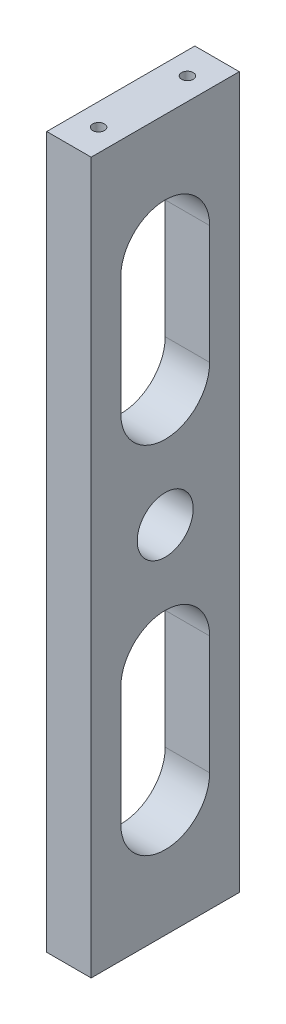
ISO-10303-21;
HEADER;
FILE_DESCRIPTION(('STEP AP214'),'2;1');
FILE_NAME('part.step','',(''),(''),'','','');
FILE_SCHEMA(('AUTOMOTIVE_DESIGN { 1 0 10303 214 1 1 1 1 }'));
ENDSEC;
DATA;
#1=APPLICATION_CONTEXT('core data for automotive mechanical design processes');
#2=APPLICATION_PROTOCOL_DEFINITION('international standard','automotive_design',2000,#1);
#3=PRODUCT_CONTEXT('',#1,'mechanical');
#4=PRODUCT('Part','Part','',(#3));
#5=PRODUCT_RELATED_PRODUCT_CATEGORY('part','',(#4));
#6=PRODUCT_DEFINITION_FORMATION('','',#4);
#7=PRODUCT_DEFINITION_CONTEXT('part definition',#1,'design');
#8=PRODUCT_DEFINITION('design','',#6,#7);
#9=PRODUCT_DEFINITION_SHAPE('','',#8);
#10=(LENGTH_UNIT() NAMED_UNIT(*) SI_UNIT(.MILLI.,.METRE.));
#11=(NAMED_UNIT(*) PLANE_ANGLE_UNIT() SI_UNIT($,.RADIAN.));
#12=(NAMED_UNIT(*) SI_UNIT($,.STERADIAN.) SOLID_ANGLE_UNIT());
#13=UNCERTAINTY_MEASURE_WITH_UNIT(LENGTH_MEASURE(1.E-05),#10,'distance_accuracy_value','');
#14=(GEOMETRIC_REPRESENTATION_CONTEXT(3) GLOBAL_UNCERTAINTY_ASSIGNED_CONTEXT((#13)) GLOBAL_UNIT_ASSIGNED_CONTEXT((#10,
#11,#12)) REPRESENTATION_CONTEXT('',''));
#15=CARTESIAN_POINT('',(0.,0.,0.));
#16=DIRECTION('',(0.,0.,1.));
#17=DIRECTION('',(1.,0.,0.));
#18=AXIS2_PLACEMENT_3D('',#15,#16,#17);
#19=CARTESIAN_POINT('',(4.7625,-76.2,-15.875));
#20=DIRECTION('',(0.,0.,1.));
#21=DIRECTION('',(1.,0.,0.));
#22=AXIS2_PLACEMENT_3D('',#19,#20,#21);
#23=PLANE('',#22);
#24=DIRECTION('',(0.,1.,0.));
#25=VECTOR('',#24,1.);
#26=CARTESIAN_POINT('',(-4.7625,-76.2,-15.875));
#27=LINE('',#26,#25);
#28=CARTESIAN_POINT('',(-4.7625,-76.2,-15.875));
#29=VERTEX_POINT('',#28);
#30=CARTESIAN_POINT('',(-4.7625,76.2,-15.875));
#31=VERTEX_POINT('',#30);
#32=EDGE_CURVE('E241',#29,#31,#27,.T.);
#33=ORIENTED_EDGE('',*,*,#32,.T.);
#34=DIRECTION('',(-1.,0.,0.));
#35=VECTOR('',#34,1.);
#36=CARTESIAN_POINT('',(4.7625,76.2,-15.875));
#37=LINE('',#36,#35);
#38=CARTESIAN_POINT('',(4.7625,76.2,-15.875));
#39=VERTEX_POINT('',#38);
#40=EDGE_CURVE('E11',#39,#31,#37,.T.);
#41=ORIENTED_EDGE('',*,*,#40,.F.);
#42=DIRECTION('',(0.,1.,0.));
#43=VECTOR('',#42,1.);
#44=CARTESIAN_POINT('',(4.7625,-76.2,-15.875));
#45=LINE('',#44,#43);
#46=CARTESIAN_POINT('',(4.7625,-76.2,-15.875));
#47=VERTEX_POINT('',#46);
#48=EDGE_CURVE('E242',#47,#39,#45,.T.);
#49=ORIENTED_EDGE('',*,*,#48,.F.);
#50=DIRECTION('',(-1.,0.,0.));
#51=VECTOR('',#50,1.);
#52=CARTESIAN_POINT('',(4.7625,-76.2,-15.875));
#53=LINE('',#52,#51);
#54=EDGE_CURVE('E252',#47,#29,#53,.T.);
#55=ORIENTED_EDGE('',*,*,#54,.T.);
#56=EDGE_LOOP('',(#33,#41,#49,#55));
#57=FACE_BOUND('',#56,.T.);
#58=ADVANCED_FACE('F42',(#57),#23,.F.);
#59=CARTESIAN_POINT('',(4.7625,76.2,15.875));
#60=DIRECTION('',(0.,-1.,0.));
#61=DIRECTION('',(0.,0.,-1.));
#62=AXIS2_PLACEMENT_3D('',#59,#60,#61);
#63=PLANE('',#62);
#64=CARTESIAN_POINT('',(0.,76.2,-9.525));
#65=DIRECTION('',(0.,1.,0.));
#66=DIRECTION('',(0.,0.,1.));
#67=AXIS2_PLACEMENT_3D('',#64,#65,#66);
#68=CIRCLE('',#67,1.24999999999999);
#69=CARTESIAN_POINT('',(0.,76.2,-8.27500000000001));
#70=VERTEX_POINT('',#69);
#71=EDGE_CURVE('E229',#70,#70,#68,.T.);
#72=ORIENTED_EDGE('',*,*,#71,.F.);
#73=EDGE_LOOP('',(#72));
#74=FACE_BOUND('',#73,.T.);
#75=CARTESIAN_POINT('',(0.,76.2,9.525));
#76=DIRECTION('',(0.,1.,0.));
#77=DIRECTION('',(0.,0.,1.));
#78=AXIS2_PLACEMENT_3D('',#75,#76,#77);
#79=CIRCLE('',#78,1.24999999999999);
#80=CARTESIAN_POINT('',(0.,76.2,10.775));
#81=VERTEX_POINT('',#80);
#82=EDGE_CURVE('E235',#81,#81,#79,.T.);
#83=ORIENTED_EDGE('',*,*,#82,.F.);
#84=EDGE_LOOP('',(#83));
#85=FACE_BOUND('',#84,.T.);
#86=DIRECTION('',(0.,0.,1.));
#87=VECTOR('',#86,1.);
#88=CARTESIAN_POINT('',(-4.7625,76.2,15.875));
#89=LINE('',#88,#87);
#90=CARTESIAN_POINT('',(-4.7625,76.2,15.875));
#91=VERTEX_POINT('',#90);
#92=EDGE_CURVE('E255',#31,#91,#89,.T.);
#93=ORIENTED_EDGE('',*,*,#92,.T.);
#94=DIRECTION('',(-1.,0.,0.));
#95=VECTOR('',#94,1.);
#96=CARTESIAN_POINT('',(4.7625,76.2,15.875));
#97=LINE('',#96,#95);
#98=CARTESIAN_POINT('',(4.7625,76.2,15.875));
#99=VERTEX_POINT('',#98);
#100=EDGE_CURVE('E49',#99,#91,#97,.T.);
#101=ORIENTED_EDGE('',*,*,#100,.F.);
#102=DIRECTION('',(0.,0.,1.));
#103=VECTOR('',#102,1.);
#104=CARTESIAN_POINT('',(4.7625,76.2,15.875));
#105=LINE('',#104,#103);
#106=EDGE_CURVE('E245',#39,#99,#105,.T.);
#107=ORIENTED_EDGE('',*,*,#106,.F.);
#108=ORIENTED_EDGE('',*,*,#40,.T.);
#109=EDGE_LOOP('',(#93,#101,#107,#108));
#110=FACE_BOUND('',#109,.T.);
#111=ADVANCED_FACE('F284',(#74,#85,#110),#63,.F.);
#112=CARTESIAN_POINT('',(4.7625,-76.2,15.875));
#113=DIRECTION('',(0.,0.,-1.));
#114=DIRECTION('',(-1.,0.,0.));
#115=AXIS2_PLACEMENT_3D('',#112,#113,#114);
#116=PLANE('',#115);
#117=DIRECTION('',(0.,-1.,0.));
#118=VECTOR('',#117,1.);
#119=CARTESIAN_POINT('',(-4.7625,-76.2,15.875));
#120=LINE('',#119,#118);
#121=CARTESIAN_POINT('',(-4.7625,-76.2,15.875));
#122=VERTEX_POINT('',#121);
#123=EDGE_CURVE('E257',#91,#122,#120,.T.);
#124=ORIENTED_EDGE('',*,*,#123,.T.);
#125=DIRECTION('',(-1.,0.,0.));
#126=VECTOR('',#125,1.);
#127=CARTESIAN_POINT('',(4.7625,-76.2,15.875));
#128=LINE('',#127,#126);
#129=CARTESIAN_POINT('',(4.7625,-76.2,15.875));
#130=VERTEX_POINT('',#129);
#131=EDGE_CURVE('E262',#130,#122,#128,.T.);
#132=ORIENTED_EDGE('',*,*,#131,.F.);
#133=DIRECTION('',(0.,-1.,0.));
#134=VECTOR('',#133,1.);
#135=CARTESIAN_POINT('',(4.7625,-76.2,15.875));
#136=LINE('',#135,#134);
#137=EDGE_CURVE('E248',#99,#130,#136,.T.);
#138=ORIENTED_EDGE('',*,*,#137,.F.);
#139=ORIENTED_EDGE('',*,*,#100,.T.);
#140=EDGE_LOOP('',(#124,#132,#138,#139));
#141=FACE_BOUND('',#140,.T.);
#142=ADVANCED_FACE('F269',(#141),#116,.F.);
#143=CARTESIAN_POINT('',(4.7625,-76.2,15.875));
#144=DIRECTION('',(0.,1.,0.));
#145=DIRECTION('',(0.,0.,1.));
#146=AXIS2_PLACEMENT_3D('',#143,#144,#145);
#147=PLANE('',#146);
#148=CARTESIAN_POINT('',(0.,-76.2,-9.525));
#149=DIRECTION('',(0.,-1.,0.));
#150=DIRECTION('',(0.,0.,-1.));
#151=AXIS2_PLACEMENT_3D('',#148,#149,#150);
#152=CIRCLE('',#151,1.24999999999999);
#153=CARTESIAN_POINT('',(0.,-76.2,-10.775));
#154=VERTEX_POINT('',#153);
#155=EDGE_CURVE('E217',#154,#154,#152,.T.);
#156=ORIENTED_EDGE('',*,*,#155,.F.);
#157=EDGE_LOOP('',(#156));
#158=FACE_BOUND('',#157,.T.);
#159=CARTESIAN_POINT('',(0.,-76.2,9.525));
#160=DIRECTION('',(0.,-1.,0.));
#161=DIRECTION('',(0.,0.,-1.));
#162=AXIS2_PLACEMENT_3D('',#159,#160,#161);
#163=CIRCLE('',#162,1.24999999999999);
#164=CARTESIAN_POINT('',(0.,-76.2,8.27500000000001));
#165=VERTEX_POINT('',#164);
#166=EDGE_CURVE('E223',#165,#165,#163,.T.);
#167=ORIENTED_EDGE('',*,*,#166,.F.);
#168=EDGE_LOOP('',(#167));
#169=FACE_BOUND('',#168,.T.);
#170=DIRECTION('',(0.,0.,-1.));
#171=VECTOR('',#170,1.);
#172=CARTESIAN_POINT('',(-4.7625,-76.2,15.875));
#173=LINE('',#172,#171);
#174=EDGE_CURVE('E246',#122,#29,#173,.T.);
#175=ORIENTED_EDGE('',*,*,#174,.T.);
#176=ORIENTED_EDGE('',*,*,#54,.F.);
#177=DIRECTION('',(0.,0.,-1.));
#178=VECTOR('',#177,1.);
#179=CARTESIAN_POINT('',(4.7625,-76.2,15.875));
#180=LINE('',#179,#178);
#181=EDGE_CURVE('E250',#130,#47,#180,.T.);
#182=ORIENTED_EDGE('',*,*,#181,.F.);
#183=ORIENTED_EDGE('',*,*,#131,.T.);
#184=EDGE_LOOP('',(#175,#176,#182,#183));
#185=FACE_BOUND('',#184,.T.);
#186=ADVANCED_FACE('F277',(#158,#169,#185),#147,.F.);
#187=CARTESIAN_POINT('',(4.7625,0.,0.));
#188=DIRECTION('',(-1.,0.,0.));
#189=DIRECTION('',(0.,0.,1.));
#190=AXIS2_PLACEMENT_3D('',#187,#188,#189);
#191=PLANE('',#190);
#192=CARTESIAN_POINT('',(4.7625,-50.8,0.));
#193=DIRECTION('',(1.,0.,0.));
#194=DIRECTION('',(0.,0.,-1.));
#195=AXIS2_PLACEMENT_3D('',#192,#193,#194);
#196=CIRCLE('',#195,9.525);
#197=CARTESIAN_POINT('',(4.7625,-50.8,9.525));
#198=VERTEX_POINT('',#197);
#199=CARTESIAN_POINT('',(4.7625,-50.8,-9.52500000000001));
#200=VERTEX_POINT('',#199);
#201=EDGE_CURVE('E173',#198,#200,#196,.T.);
#202=ORIENTED_EDGE('',*,*,#201,.F.);
#203=DIRECTION('',(0.,-1.,0.));
#204=VECTOR('',#203,1.);
#205=CARTESIAN_POINT('',(4.7625,0.,9.525));
#206=LINE('',#205,#204);
#207=CARTESIAN_POINT('',(4.7625,-25.4,9.52499999999999));
#208=VERTEX_POINT('',#207);
#209=EDGE_CURVE('E56',#208,#198,#206,.T.);
#210=ORIENTED_EDGE('',*,*,#209,.F.);
#211=CARTESIAN_POINT('',(4.7625,-25.4,0.));
#212=DIRECTION('',(1.,0.,0.));
#213=DIRECTION('',(0.,0.,-1.));
#214=AXIS2_PLACEMENT_3D('',#211,#212,#213);
#215=CIRCLE('',#214,9.525);
#216=CARTESIAN_POINT('',(4.7625,-25.4,-9.52500000000001));
#217=VERTEX_POINT('',#216);
#218=EDGE_CURVE('E164',#217,#208,#215,.T.);
#219=ORIENTED_EDGE('',*,*,#218,.F.);
#220=DIRECTION('',(0.,-1.,0.));
#221=VECTOR('',#220,1.);
#222=CARTESIAN_POINT('',(4.7625,0.,-9.52500000000001));
#223=LINE('',#222,#221);
#224=EDGE_CURVE('E167',#217,#200,#223,.T.);
#225=ORIENTED_EDGE('',*,*,#224,.T.);
#226=EDGE_LOOP('',(#202,#210,#219,#225));
#227=FACE_BOUND('',#226,.T.);
#228=DIRECTION('',(0.,-1.,0.));
#229=VECTOR('',#228,1.);
#230=CARTESIAN_POINT('',(4.7625,0.,-9.52500000000001));
#231=LINE('',#230,#229);
#232=CARTESIAN_POINT('',(4.7625,50.8,-9.52500000000001));
#233=VERTEX_POINT('',#232);
#234=CARTESIAN_POINT('',(4.7625,25.4,-9.52500000000001));
#235=VERTEX_POINT('',#234);
#236=EDGE_CURVE('E198',#233,#235,#231,.T.);
#237=ORIENTED_EDGE('',*,*,#236,.T.);
#238=CARTESIAN_POINT('',(4.7625,25.4,0.));
#239=DIRECTION('',(1.,0.,0.));
#240=DIRECTION('',(0.,0.,-1.));
#241=AXIS2_PLACEMENT_3D('',#238,#239,#240);
#242=CIRCLE('',#241,9.525);
#243=CARTESIAN_POINT('',(4.7625,25.4,9.52499999999999));
#244=VERTEX_POINT('',#243);
#245=EDGE_CURVE('E64',#244,#235,#242,.T.);
#246=ORIENTED_EDGE('',*,*,#245,.F.);
#247=DIRECTION('',(0.,-1.,0.));
#248=VECTOR('',#247,1.);
#249=CARTESIAN_POINT('',(4.7625,0.,9.525));
#250=LINE('',#249,#248);
#251=CARTESIAN_POINT('',(4.7625,50.8,9.52499999999998));
#252=VERTEX_POINT('',#251);
#253=EDGE_CURVE('E188',#252,#244,#250,.T.);
#254=ORIENTED_EDGE('',*,*,#253,.F.);
#255=CARTESIAN_POINT('',(4.7625,50.8,0.));
#256=DIRECTION('',(1.,0.,0.));
#257=DIRECTION('',(0.,0.,-1.));
#258=AXIS2_PLACEMENT_3D('',#255,#256,#257);
#259=CIRCLE('',#258,9.525);
#260=EDGE_CURVE('E201',#233,#252,#259,.T.);
#261=ORIENTED_EDGE('',*,*,#260,.F.);
#262=EDGE_LOOP('',(#237,#246,#254,#261));
#263=FACE_BOUND('',#262,.T.);
#264=CARTESIAN_POINT('',(4.7625,0.,0.));
#265=DIRECTION('',(1.,0.,0.));
#266=DIRECTION('',(0.,0.,-1.));
#267=AXIS2_PLACEMENT_3D('',#264,#265,#266);
#268=CIRCLE('',#267,5.99999999999999);
#269=CARTESIAN_POINT('',(4.7625,0.,-5.99999999999993));
#270=VERTEX_POINT('',#269);
#271=EDGE_CURVE('E180',#270,#270,#268,.T.);
#272=ORIENTED_EDGE('',*,*,#271,.F.);
#273=EDGE_LOOP('',(#272));
#274=FACE_BOUND('',#273,.T.);
#275=ORIENTED_EDGE('',*,*,#48,.T.);
#276=ORIENTED_EDGE('',*,*,#106,.T.);
#277=ORIENTED_EDGE('',*,*,#137,.T.);
#278=ORIENTED_EDGE('',*,*,#181,.T.);
#279=EDGE_LOOP('',(#275,#276,#277,#278));
#280=FACE_BOUND('',#279,.T.);
#281=ADVANCED_FACE('F283',(#227,#263,#274,#280),#191,.F.);
#282=CARTESIAN_POINT('',(-4.7625,0.,0.));
#283=DIRECTION('',(-1.,0.,0.));
#284=DIRECTION('',(0.,0.,1.));
#285=AXIS2_PLACEMENT_3D('',#282,#283,#284);
#286=PLANE('',#285);
#287=DIRECTION('',(0.,-1.,0.));
#288=VECTOR('',#287,1.);
#289=CARTESIAN_POINT('',(-4.7625,0.,9.525));
#290=LINE('',#289,#288);
#291=CARTESIAN_POINT('',(-4.7625,-25.4,9.52499999999999));
#292=VERTEX_POINT('',#291);
#293=CARTESIAN_POINT('',(-4.7625,-50.8,9.52499999999998));
#294=VERTEX_POINT('',#293);
#295=EDGE_CURVE('E145',#292,#294,#290,.T.);
#296=ORIENTED_EDGE('',*,*,#295,.T.);
#297=CARTESIAN_POINT('',(-4.7625,-50.8,0.));
#298=DIRECTION('',(1.,0.,0.));
#299=DIRECTION('',(0.,0.,-1.));
#300=AXIS2_PLACEMENT_3D('',#297,#298,#299);
#301=CIRCLE('',#300,9.525);
#302=CARTESIAN_POINT('',(-4.7625,-50.8,-9.525));
#303=VERTEX_POINT('',#302);
#304=EDGE_CURVE('E154',#294,#303,#301,.T.);
#305=ORIENTED_EDGE('',*,*,#304,.T.);
#306=DIRECTION('',(0.,-1.,0.));
#307=VECTOR('',#306,1.);
#308=CARTESIAN_POINT('',(-4.7625,0.,-9.52500000000001));
#309=LINE('',#308,#307);
#310=CARTESIAN_POINT('',(-4.7625,-25.4,-9.52500000000001));
#311=VERTEX_POINT('',#310);
#312=EDGE_CURVE('E159',#311,#303,#309,.T.);
#313=ORIENTED_EDGE('',*,*,#312,.F.);
#314=CARTESIAN_POINT('',(-4.7625,-25.4,0.));
#315=DIRECTION('',(1.,0.,0.));
#316=DIRECTION('',(0.,0.,-1.));
#317=AXIS2_PLACEMENT_3D('',#314,#315,#316);
#318=CIRCLE('',#317,9.525);
#319=EDGE_CURVE('E151',#311,#292,#318,.T.);
#320=ORIENTED_EDGE('',*,*,#319,.T.);
#321=EDGE_LOOP('',(#296,#305,#313,#320));
#322=FACE_BOUND('',#321,.T.);
#323=CARTESIAN_POINT('',(-4.7625,25.4,0.));
#324=DIRECTION('',(1.,0.,0.));
#325=DIRECTION('',(0.,0.,-1.));
#326=AXIS2_PLACEMENT_3D('',#323,#324,#325);
#327=CIRCLE('',#326,9.525);
#328=CARTESIAN_POINT('',(-4.7625,25.4,9.52499999999999));
#329=VERTEX_POINT('',#328);
#330=CARTESIAN_POINT('',(-4.7625,25.4,-9.52500000000001));
#331=VERTEX_POINT('',#330);
#332=EDGE_CURVE('E184',#329,#331,#327,.T.);
#333=ORIENTED_EDGE('',*,*,#332,.T.);
#334=DIRECTION('',(0.,-1.,0.));
#335=VECTOR('',#334,1.);
#336=CARTESIAN_POINT('',(-4.7625,0.,-9.52500000000001));
#337=LINE('',#336,#335);
#338=CARTESIAN_POINT('',(-4.7625,50.8,-9.52500000000001));
#339=VERTEX_POINT('',#338);
#340=EDGE_CURVE('E187',#339,#331,#337,.T.);
#341=ORIENTED_EDGE('',*,*,#340,.F.);
#342=CARTESIAN_POINT('',(-4.7625,50.8,0.));
#343=DIRECTION('',(1.,0.,0.));
#344=DIRECTION('',(0.,0.,-1.));
#345=AXIS2_PLACEMENT_3D('',#342,#343,#344);
#346=CIRCLE('',#345,9.525);
#347=CARTESIAN_POINT('',(-4.7625,50.8,9.52499999999998));
#348=VERTEX_POINT('',#347);
#349=EDGE_CURVE('E190',#339,#348,#346,.T.);
#350=ORIENTED_EDGE('',*,*,#349,.T.);
#351=DIRECTION('',(0.,-1.,0.));
#352=VECTOR('',#351,1.);
#353=CARTESIAN_POINT('',(-4.7625,0.,9.525));
#354=LINE('',#353,#352);
#355=EDGE_CURVE('E193',#348,#329,#354,.T.);
#356=ORIENTED_EDGE('',*,*,#355,.T.);
#357=EDGE_LOOP('',(#333,#341,#350,#356));
#358=FACE_BOUND('',#357,.T.);
#359=CARTESIAN_POINT('',(-4.7625,0.,0.));
#360=DIRECTION('',(1.,0.,0.));
#361=DIRECTION('',(0.,0.,-1.));
#362=AXIS2_PLACEMENT_3D('',#359,#360,#361);
#363=CIRCLE('',#362,6.);
#364=CARTESIAN_POINT('',(-4.7625,0.,-5.99999999999994));
#365=VERTEX_POINT('',#364);
#366=EDGE_CURVE('E214',#365,#365,#363,.T.);
#367=ORIENTED_EDGE('',*,*,#366,.T.);
#368=EDGE_LOOP('',(#367));
#369=FACE_BOUND('',#368,.T.);
#370=ORIENTED_EDGE('',*,*,#32,.F.);
#371=ORIENTED_EDGE('',*,*,#174,.F.);
#372=ORIENTED_EDGE('',*,*,#123,.F.);
#373=ORIENTED_EDGE('',*,*,#92,.F.);
#374=EDGE_LOOP('',(#370,#371,#372,#373));
#375=FACE_BOUND('',#374,.T.);
#376=ADVANCED_FACE('F161',(#322,#358,#369,#375),#286,.T.);
#377=CARTESIAN_POINT('',(0.,63.5,9.525));
#378=DIRECTION('',(0.,1.,0.));
#379=DIRECTION('',(0.,0.,1.));
#380=AXIS2_PLACEMENT_3D('',#377,#378,#379);
#381=CONICAL_SURFACE('',#380,1.25,1.02974425867666);
#382=CARTESIAN_POINT('',(0.,62.7489242262155,9.525));
#383=VERTEX_POINT('',#382);
#384=VERTEX_LOOP('',#383);
#385=FACE_BOUND('',#384,.T.);
#386=CARTESIAN_POINT('',(0.,63.5,9.525));
#387=DIRECTION('',(0.,1.,0.));
#388=DIRECTION('',(0.,0.,1.));
#389=AXIS2_PLACEMENT_3D('',#386,#387,#388);
#390=CIRCLE('',#389,1.25);
#391=CARTESIAN_POINT('',(0.,63.5,10.775));
#392=VERTEX_POINT('',#391);
#393=EDGE_CURVE('E238',#392,#392,#390,.T.);
#394=ORIENTED_EDGE('',*,*,#393,.T.);
#395=EDGE_LOOP('',(#394));
#396=FACE_BOUND('',#395,.T.);
#397=ADVANCED_FACE('F300',(#385,#396),#381,.F.);
#398=CARTESIAN_POINT('',(0.,76.2,9.525));
#399=DIRECTION('',(0.,1.,0.));
#400=DIRECTION('',(0.,0.,1.));
#401=AXIS2_PLACEMENT_3D('',#398,#399,#400);
#402=CYLINDRICAL_SURFACE('',#401,1.24999999999999);
#403=ORIENTED_EDGE('',*,*,#393,.F.);
#404=EDGE_LOOP('',(#403));
#405=FACE_BOUND('',#404,.T.);
#406=ORIENTED_EDGE('',*,*,#82,.T.);
#407=EDGE_LOOP('',(#406));
#408=FACE_BOUND('',#407,.T.);
#409=ADVANCED_FACE('F306',(#405,#408),#402,.F.);
#410=CARTESIAN_POINT('',(0.,63.5,-9.525));
#411=DIRECTION('',(0.,1.,0.));
#412=DIRECTION('',(0.,0.,1.));
#413=AXIS2_PLACEMENT_3D('',#410,#411,#412);
#414=CONICAL_SURFACE('',#413,1.25,1.02974425867666);
#415=CARTESIAN_POINT('',(0.,62.7489242262155,-9.525));
#416=VERTEX_POINT('',#415);
#417=VERTEX_LOOP('',#416);
#418=FACE_BOUND('',#417,.T.);
#419=CARTESIAN_POINT('',(0.,63.5,-9.525));
#420=DIRECTION('',(0.,1.,0.));
#421=DIRECTION('',(0.,0.,1.));
#422=AXIS2_PLACEMENT_3D('',#419,#420,#421);
#423=CIRCLE('',#422,1.25);
#424=CARTESIAN_POINT('',(0.,63.5,-8.275));
#425=VERTEX_POINT('',#424);
#426=EDGE_CURVE('E232',#425,#425,#423,.T.);
#427=ORIENTED_EDGE('',*,*,#426,.T.);
#428=EDGE_LOOP('',(#427));
#429=FACE_BOUND('',#428,.T.);
#430=ADVANCED_FACE('F310',(#418,#429),#414,.F.);
#431=CARTESIAN_POINT('',(0.,76.2,-9.525));
#432=DIRECTION('',(0.,1.,0.));
#433=DIRECTION('',(0.,0.,1.));
#434=AXIS2_PLACEMENT_3D('',#431,#432,#433);
#435=CYLINDRICAL_SURFACE('',#434,1.24999999999999);
#436=ORIENTED_EDGE('',*,*,#426,.F.);
#437=EDGE_LOOP('',(#436));
#438=FACE_BOUND('',#437,.T.);
#439=ORIENTED_EDGE('',*,*,#71,.T.);
#440=EDGE_LOOP('',(#439));
#441=FACE_BOUND('',#440,.T.);
#442=ADVANCED_FACE('F314',(#438,#441),#435,.F.);
#443=CARTESIAN_POINT('',(0.,-63.5,9.525));
#444=DIRECTION('',(0.,-1.,0.));
#445=DIRECTION('',(0.,0.,-1.));
#446=AXIS2_PLACEMENT_3D('',#443,#444,#445);
#447=CONICAL_SURFACE('',#446,1.25,1.02974425867666);
#448=CARTESIAN_POINT('',(0.,-62.7489242262155,9.525));
#449=VERTEX_POINT('',#448);
#450=VERTEX_LOOP('',#449);
#451=FACE_BOUND('',#450,.T.);
#452=CARTESIAN_POINT('',(0.,-63.5,9.525));
#453=DIRECTION('',(0.,-1.,0.));
#454=DIRECTION('',(0.,0.,-1.));
#455=AXIS2_PLACEMENT_3D('',#452,#453,#454);
#456=CIRCLE('',#455,1.25);
#457=CARTESIAN_POINT('',(0.,-63.5,8.275));
#458=VERTEX_POINT('',#457);
#459=EDGE_CURVE('E226',#458,#458,#456,.T.);
#460=ORIENTED_EDGE('',*,*,#459,.T.);
#461=EDGE_LOOP('',(#460));
#462=FACE_BOUND('',#461,.T.);
#463=ADVANCED_FACE('F318',(#451,#462),#447,.F.);
#464=CARTESIAN_POINT('',(0.,-76.2,9.525));
#465=DIRECTION('',(0.,-1.,0.));
#466=DIRECTION('',(0.,0.,-1.));
#467=AXIS2_PLACEMENT_3D('',#464,#465,#466);
#468=CYLINDRICAL_SURFACE('',#467,1.24999999999999);
#469=ORIENTED_EDGE('',*,*,#459,.F.);
#470=EDGE_LOOP('',(#469));
#471=FACE_BOUND('',#470,.T.);
#472=ORIENTED_EDGE('',*,*,#166,.T.);
#473=EDGE_LOOP('',(#472));
#474=FACE_BOUND('',#473,.T.);
#475=ADVANCED_FACE('F322',(#471,#474),#468,.F.);
#476=CARTESIAN_POINT('',(0.,-63.5,-9.525));
#477=DIRECTION('',(0.,-1.,0.));
#478=DIRECTION('',(0.,0.,-1.));
#479=AXIS2_PLACEMENT_3D('',#476,#477,#478);
#480=CONICAL_SURFACE('',#479,1.25,1.02974425867666);
#481=CARTESIAN_POINT('',(0.,-62.7489242262155,-9.525));
#482=VERTEX_POINT('',#481);
#483=VERTEX_LOOP('',#482);
#484=FACE_BOUND('',#483,.T.);
#485=CARTESIAN_POINT('',(0.,-63.5,-9.525));
#486=DIRECTION('',(0.,-1.,0.));
#487=DIRECTION('',(0.,0.,-1.));
#488=AXIS2_PLACEMENT_3D('',#485,#486,#487);
#489=CIRCLE('',#488,1.25);
#490=CARTESIAN_POINT('',(0.,-63.5,-10.775));
#491=VERTEX_POINT('',#490);
#492=EDGE_CURVE('E220',#491,#491,#489,.T.);
#493=ORIENTED_EDGE('',*,*,#492,.T.);
#494=EDGE_LOOP('',(#493));
#495=FACE_BOUND('',#494,.T.);
#496=ADVANCED_FACE('F326',(#484,#495),#480,.F.);
#497=CARTESIAN_POINT('',(0.,-76.2,-9.525));
#498=DIRECTION('',(0.,-1.,0.));
#499=DIRECTION('',(0.,0.,-1.));
#500=AXIS2_PLACEMENT_3D('',#497,#498,#499);
#501=CYLINDRICAL_SURFACE('',#500,1.24999999999999);
#502=ORIENTED_EDGE('',*,*,#492,.F.);
#503=EDGE_LOOP('',(#502));
#504=FACE_BOUND('',#503,.T.);
#505=ORIENTED_EDGE('',*,*,#155,.T.);
#506=EDGE_LOOP('',(#505));
#507=FACE_BOUND('',#506,.T.);
#508=ADVANCED_FACE('F330',(#504,#507),#501,.F.);
#509=CARTESIAN_POINT('',(4.7625,0.,0.));
#510=DIRECTION('',(1.,0.,0.));
#511=DIRECTION('',(0.,0.,-1.));
#512=AXIS2_PLACEMENT_3D('',#509,#510,#511);
#513=CYLINDRICAL_SURFACE('',#512,5.99999999999999);
#514=ORIENTED_EDGE('',*,*,#366,.F.);
#515=EDGE_LOOP('',(#514));
#516=FACE_BOUND('',#515,.T.);
#517=ORIENTED_EDGE('',*,*,#271,.T.);
#518=EDGE_LOOP('',(#517));
#519=FACE_BOUND('',#518,.T.);
#520=ADVANCED_FACE('F334',(#516,#519),#513,.F.);
#521=CARTESIAN_POINT('',(-4.7625,25.4,0.));
#522=DIRECTION('',(1.,0.,0.));
#523=DIRECTION('',(0.,0.,-1.));
#524=AXIS2_PLACEMENT_3D('',#521,#522,#523);
#525=CYLINDRICAL_SURFACE('',#524,9.525);
#526=ORIENTED_EDGE('',*,*,#245,.T.);
#527=DIRECTION('',(1.,0.,0.));
#528=VECTOR('',#527,1.);
#529=CARTESIAN_POINT('',(-4.7625,25.4,-9.52500000000001));
#530=LINE('',#529,#528);
#531=EDGE_CURVE('E196',#331,#235,#530,.T.);
#532=ORIENTED_EDGE('',*,*,#531,.F.);
#533=ORIENTED_EDGE('',*,*,#332,.F.);
#534=DIRECTION('',(1.,0.,0.));
#535=VECTOR('',#534,1.);
#536=CARTESIAN_POINT('',(-4.7625,25.4,9.52499999999999));
#537=LINE('',#536,#535);
#538=EDGE_CURVE('E174',#329,#244,#537,.T.);
#539=ORIENTED_EDGE('',*,*,#538,.T.);
#540=EDGE_LOOP('',(#526,#532,#533,#539));
#541=FACE_BOUND('',#540,.T.);
#542=ADVANCED_FACE('F338',(#541),#525,.F.);
#543=CARTESIAN_POINT('',(-4.7625,0.,9.525));
#544=DIRECTION('',(0.,0.,1.));
#545=DIRECTION('',(0.,-1.,0.));
#546=AXIS2_PLACEMENT_3D('',#543,#544,#545);
#547=PLANE('',#546);
#548=ORIENTED_EDGE('',*,*,#253,.T.);
#549=ORIENTED_EDGE('',*,*,#538,.F.);
#550=ORIENTED_EDGE('',*,*,#355,.F.);
#551=DIRECTION('',(1.,0.,0.));
#552=VECTOR('',#551,1.);
#553=CARTESIAN_POINT('',(-4.7625,50.8,9.52499999999998));
#554=LINE('',#553,#552);
#555=EDGE_CURVE('E207',#348,#252,#554,.T.);
#556=ORIENTED_EDGE('',*,*,#555,.T.);
#557=EDGE_LOOP('',(#548,#549,#550,#556));
#558=FACE_BOUND('',#557,.T.);
#559=ADVANCED_FACE('F342',(#558),#547,.F.);
#560=CARTESIAN_POINT('',(-4.7625,50.8,0.));
#561=DIRECTION('',(1.,0.,0.));
#562=DIRECTION('',(0.,0.,-1.));
#563=AXIS2_PLACEMENT_3D('',#560,#561,#562);
#564=CYLINDRICAL_SURFACE('',#563,9.525);
#565=ORIENTED_EDGE('',*,*,#260,.T.);
#566=ORIENTED_EDGE('',*,*,#555,.F.);
#567=ORIENTED_EDGE('',*,*,#349,.F.);
#568=DIRECTION('',(1.,0.,0.));
#569=VECTOR('',#568,1.);
#570=CARTESIAN_POINT('',(-4.7625,50.8,-9.52500000000001));
#571=LINE('',#570,#569);
#572=EDGE_CURVE('E209',#339,#233,#571,.T.);
#573=ORIENTED_EDGE('',*,*,#572,.T.);
#574=EDGE_LOOP('',(#565,#566,#567,#573));
#575=FACE_BOUND('',#574,.T.);
#576=ADVANCED_FACE('F346',(#575),#564,.F.);
#577=CARTESIAN_POINT('',(-4.7625,0.,-9.52500000000001));
#578=DIRECTION('',(0.,0.,1.));
#579=DIRECTION('',(0.,-1.,0.));
#580=AXIS2_PLACEMENT_3D('',#577,#578,#579);
#581=PLANE('',#580);
#582=ORIENTED_EDGE('',*,*,#236,.F.);
#583=ORIENTED_EDGE('',*,*,#572,.F.);
#584=ORIENTED_EDGE('',*,*,#340,.T.);
#585=ORIENTED_EDGE('',*,*,#531,.T.);
#586=EDGE_LOOP('',(#582,#583,#584,#585));
#587=FACE_BOUND('',#586,.T.);
#588=ADVANCED_FACE('F343',(#587),#581,.T.);
#589=CARTESIAN_POINT('',(-4.7625,0.,9.525));
#590=DIRECTION('',(0.,0.,1.));
#591=DIRECTION('',(0.,-1.,0.));
#592=AXIS2_PLACEMENT_3D('',#589,#590,#591);
#593=PLANE('',#592);
#594=ORIENTED_EDGE('',*,*,#209,.T.);
#595=DIRECTION('',(1.,0.,0.));
#596=VECTOR('',#595,1.);
#597=CARTESIAN_POINT('',(-4.7625,-50.8,9.52499999999998));
#598=LINE('',#597,#596);
#599=EDGE_CURVE('E141',#294,#198,#598,.T.);
#600=ORIENTED_EDGE('',*,*,#599,.F.);
#601=ORIENTED_EDGE('',*,*,#295,.F.);
#602=DIRECTION('',(1.,0.,0.));
#603=VECTOR('',#602,1.);
#604=CARTESIAN_POINT('',(-4.7625,-25.4,9.52499999999999));
#605=LINE('',#604,#603);
#606=EDGE_CURVE('E178',#292,#208,#605,.T.);
#607=ORIENTED_EDGE('',*,*,#606,.T.);
#608=EDGE_LOOP('',(#594,#600,#601,#607));
#609=FACE_BOUND('',#608,.T.);
#610=ADVANCED_FACE('F143',(#609),#593,.F.);
#611=CARTESIAN_POINT('',(-4.7625,-25.4,0.));
#612=DIRECTION('',(1.,0.,0.));
#613=DIRECTION('',(0.,0.,-1.));
#614=AXIS2_PLACEMENT_3D('',#611,#612,#613);
#615=CYLINDRICAL_SURFACE('',#614,9.525);
#616=ORIENTED_EDGE('',*,*,#218,.T.);
#617=ORIENTED_EDGE('',*,*,#606,.F.);
#618=ORIENTED_EDGE('',*,*,#319,.F.);
#619=DIRECTION('',(1.,0.,0.));
#620=VECTOR('',#619,1.);
#621=CARTESIAN_POINT('',(-4.7625,-25.4,-9.52500000000001));
#622=LINE('',#621,#620);
#623=EDGE_CURVE('E181',#311,#217,#622,.T.);
#624=ORIENTED_EDGE('',*,*,#623,.T.);
#625=EDGE_LOOP('',(#616,#617,#618,#624));
#626=FACE_BOUND('',#625,.T.);
#627=ADVANCED_FACE('F356',(#626),#615,.F.);
#628=CARTESIAN_POINT('',(-4.7625,0.,-9.52500000000001));
#629=DIRECTION('',(0.,0.,1.));
#630=DIRECTION('',(0.,-1.,0.));
#631=AXIS2_PLACEMENT_3D('',#628,#629,#630);
#632=PLANE('',#631);
#633=ORIENTED_EDGE('',*,*,#224,.F.);
#634=ORIENTED_EDGE('',*,*,#623,.F.);
#635=ORIENTED_EDGE('',*,*,#312,.T.);
#636=DIRECTION('',(1.,0.,0.));
#637=VECTOR('',#636,1.);
#638=CARTESIAN_POINT('',(-4.7625,-50.8,-9.52500000000001));
#639=LINE('',#638,#637);
#640=EDGE_CURVE('E150',#303,#200,#639,.T.);
#641=ORIENTED_EDGE('',*,*,#640,.T.);
#642=EDGE_LOOP('',(#633,#634,#635,#641));
#643=FACE_BOUND('',#642,.T.);
#644=ADVANCED_FACE('F359',(#643),#632,.T.);
#645=CARTESIAN_POINT('',(-4.7625,-50.8,0.));
#646=DIRECTION('',(1.,0.,0.));
#647=DIRECTION('',(0.,0.,-1.));
#648=AXIS2_PLACEMENT_3D('',#645,#646,#647);
#649=CYLINDRICAL_SURFACE('',#648,9.525);
#650=ORIENTED_EDGE('',*,*,#201,.T.);
#651=ORIENTED_EDGE('',*,*,#640,.F.);
#652=ORIENTED_EDGE('',*,*,#304,.F.);
#653=ORIENTED_EDGE('',*,*,#599,.T.);
#654=EDGE_LOOP('',(#650,#651,#652,#653));
#655=FACE_BOUND('',#654,.T.);
#656=ADVANCED_FACE('F155',(#655),#649,.F.);
#657=CLOSED_SHELL('',(#58,#111,#142,#186,#281,#376,#397,#409,#430,#442,#463,#475,#496,#508,#520,
#542,#559,#576,#588,#610,#627,#644,#656));
#658=MANIFOLD_SOLID_BREP('B2',#657);
#659=ADVANCED_BREP_SHAPE_REPRESENTATION('',(#18,#658),#14);
#660=SHAPE_DEFINITION_REPRESENTATION(#9,#659);
ENDSEC;
END-ISO-10303-21;
